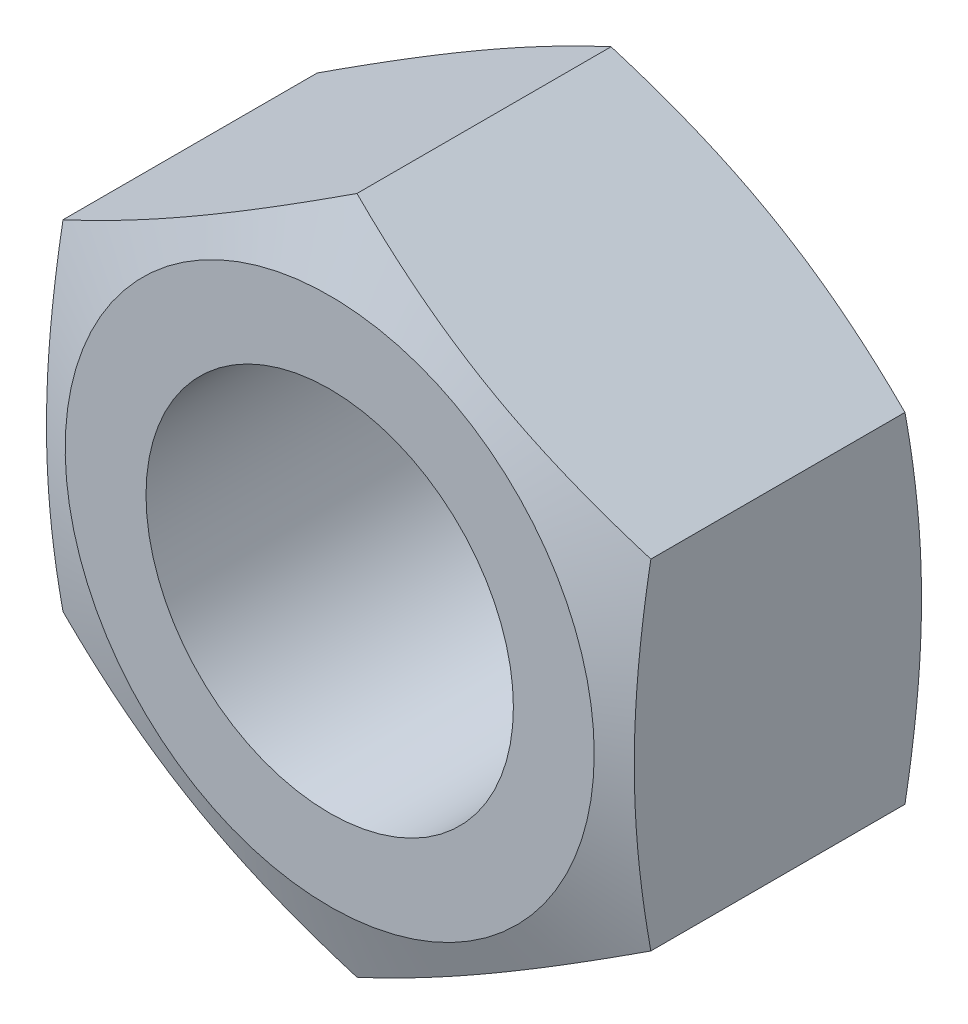
ISO-10303-21;
HEADER;
FILE_DESCRIPTION(('STEP AP214'),'2;1');
FILE_NAME('part.step','',(''),(''),'','','');
FILE_SCHEMA(('AUTOMOTIVE_DESIGN { 1 0 10303 214 1 1 1 1 }'));
ENDSEC;
DATA;
#1=APPLICATION_CONTEXT('core data for automotive mechanical design processes');
#2=APPLICATION_PROTOCOL_DEFINITION('international standard','automotive_design',2000,#1);
#3=PRODUCT_CONTEXT('',#1,'mechanical');
#4=PRODUCT('Part','Part','',(#3));
#5=PRODUCT_RELATED_PRODUCT_CATEGORY('part','',(#4));
#6=PRODUCT_DEFINITION_FORMATION('','',#4);
#7=PRODUCT_DEFINITION_CONTEXT('part definition',#1,'design');
#8=PRODUCT_DEFINITION('design','',#6,#7);
#9=PRODUCT_DEFINITION_SHAPE('','',#8);
#10=(LENGTH_UNIT() NAMED_UNIT(*) SI_UNIT(.MILLI.,.METRE.));
#11=(NAMED_UNIT(*) PLANE_ANGLE_UNIT() SI_UNIT($,.RADIAN.));
#12=(NAMED_UNIT(*) SI_UNIT($,.STERADIAN.) SOLID_ANGLE_UNIT());
#13=UNCERTAINTY_MEASURE_WITH_UNIT(LENGTH_MEASURE(1.E-05),#10,'distance_accuracy_value','');
#14=(GEOMETRIC_REPRESENTATION_CONTEXT(3) GLOBAL_UNCERTAINTY_ASSIGNED_CONTEXT((#13)) GLOBAL_UNIT_ASSIGNED_CONTEXT((#10,
#11,#12)) REPRESENTATION_CONTEXT('',''));
#15=CARTESIAN_POINT('',(0.,0.,0.));
#16=DIRECTION('',(0.,0.,1.));
#17=DIRECTION('',(1.,0.,0.));
#18=AXIS2_PLACEMENT_3D('',#15,#16,#17);
#19=CARTESIAN_POINT('',(8.,4.61880215351701,8.4));
#20=DIRECTION('',(-0.5,-0.866025403784439,0.));
#21=DIRECTION('',(0.866025403784439,-0.5,0.));
#22=AXIS2_PLACEMENT_3D('',#19,#20,#21);
#23=PLANE('',#22);
#24=DIRECTION('',(0.,0.,-1.));
#25=VECTOR('',#24,1.);
#26=CARTESIAN_POINT('',(8.,4.61880215351701,8.4));
#27=LINE('',#26,#25);
#28=CARTESIAN_POINT('',(8.,4.61880215351701,7.65837268302702));
#29=VERTEX_POINT('',#28);
#30=CARTESIAN_POINT('',(8.,4.61880215351701,0.741627316972978));
#31=VERTEX_POINT('',#30);
#32=EDGE_CURVE('E100',#29,#31,#27,.T.);
#33=ORIENTED_EDGE('',*,*,#32,.T.);
#34=CARTESIAN_POINT('',(8.0002,4.61868668346317,0.741669345423533));
#35=CARTESIAN_POINT('',(7.66888592492353,4.80997095389488,0.672022065070619));
#36=CARTESIAN_POINT('',(7.33647933019919,5.00188599083938,0.608665849997043));
#37=CARTESIAN_POINT('',(6.66950483220077,5.38696389680139,0.497200441182387));
#38=CARTESIAN_POINT('',(6.33493544541599,5.58012762232419,0.449103177974534));
#39=CARTESIAN_POINT('',(5.66734825651873,5.96555926554157,0.371307250387889));
#40=CARTESIAN_POINT('',(5.33434570003487,6.15781838116836,0.341438903740367));
#41=CARTESIAN_POINT('',(4.66756186968372,6.54278620511289,0.301377060887247));
#42=CARTESIAN_POINT('',(4.33378093484186,6.7354947176942,0.291176187412957));
#43=CARTESIAN_POINT('',(3.66621906515814,7.12091174285682,0.291176187412957));
#44=CARTESIAN_POINT('',(3.33243813031628,7.31362025543813,0.301377060887247));
#45=CARTESIAN_POINT('',(2.66565429996513,7.69858807938267,0.341438903740368));
#46=CARTESIAN_POINT('',(2.33265174348127,7.89084719500945,0.371307250387889));
#47=CARTESIAN_POINT('',(1.66506455458401,8.27627883822683,0.449103177974535));
#48=CARTESIAN_POINT('',(1.33049516779923,8.46944256374963,0.497200441182387));
#49=CARTESIAN_POINT('',(0.663520669800808,8.85452046971164,0.608665849997044));
#50=CARTESIAN_POINT('',(0.331114075076467,9.04643550665614,0.67202206507062));
#51=CARTESIAN_POINT('',(-0.000199999999998605,9.23771977708785,0.741669345423534));
#52=B_SPLINE_CURVE_WITH_KNOTS('',3,(#34,#35,#36,#37,#38,#39,#40,#41,#42,#43,#44,#45,#46,#47,#48,
#49,#50,#51),.UNSPECIFIED.,.F.,.F.,(4,2,2,2,2,2,2,2,4),(0.,1.16669003993239,2.33429004568844,
3.4908488399045,4.6469737244799,5.80309860905531,6.95965740327137,8.12725740902741,
9.2939474489598),.UNSPECIFIED.);
#53=CARTESIAN_POINT('',(0.,9.23760430703401,0.741627316972978));
#54=VERTEX_POINT('',#53);
#55=EDGE_CURVE('E51',#31,#54,#52,.T.);
#56=ORIENTED_EDGE('',*,*,#55,.T.);
#57=DIRECTION('',(0.,0.,-1.));
#58=VECTOR('',#57,1.);
#59=CARTESIAN_POINT('',(0.,9.23760430703402,8.4));
#60=LINE('',#59,#58);
#61=CARTESIAN_POINT('',(0.,9.23760430703401,7.65837268302702));
#62=VERTEX_POINT('',#61);
#63=EDGE_CURVE('E11',#62,#54,#60,.T.);
#64=ORIENTED_EDGE('',*,*,#63,.F.);
#65=CARTESIAN_POINT('',(-0.000199999999999179,9.23771977708785,7.65833065457647));
#66=CARTESIAN_POINT('',(0.331114075076465,9.04643550665614,7.72797793492938));
#67=CARTESIAN_POINT('',(0.663520669800806,8.85452046971164,7.79133415000296));
#68=CARTESIAN_POINT('',(1.33049516779923,8.46944256374963,7.90279955881761));
#69=CARTESIAN_POINT('',(1.66506455458401,8.27627883822683,7.95089682202547));
#70=CARTESIAN_POINT('',(2.33265174348127,7.89084719500945,8.02869274961211));
#71=CARTESIAN_POINT('',(2.66565429996513,7.69858807938266,8.05856109625963));
#72=CARTESIAN_POINT('',(3.33243813031629,7.31362025543813,8.09862293911275));
#73=CARTESIAN_POINT('',(3.66621906515814,7.12091174285682,8.10882381258704));
#74=CARTESIAN_POINT('',(4.33378093484186,6.7354947176942,8.10882381258704));
#75=CARTESIAN_POINT('',(4.66756186968372,6.54278620511289,8.09862293911275));
#76=CARTESIAN_POINT('',(5.33434570003487,6.15781838116836,8.05856109625963));
#77=CARTESIAN_POINT('',(5.66734825651873,5.96555926554157,8.02869274961211));
#78=CARTESIAN_POINT('',(6.33493544541599,5.58012762232419,7.95089682202547));
#79=CARTESIAN_POINT('',(6.66950483220077,5.38696389680139,7.90279955881761));
#80=CARTESIAN_POINT('',(7.33647933019919,5.00188599083938,7.79133415000296));
#81=CARTESIAN_POINT('',(7.66888592492353,4.80997095389488,7.72797793492938));
#82=CARTESIAN_POINT('',(8.0002,4.61868668346317,7.65833065457647));
#83=B_SPLINE_CURVE_WITH_KNOTS('',3,(#65,#66,#67,#68,#69,#70,#71,#72,#73,#74,#75,#76,#77,#78,#79,
#80,#81,#82),.UNSPECIFIED.,.F.,.F.,(4,2,2,2,2,2,2,2,4),(0.,1.16669003993239,2.33429004568844,
3.4908488399045,4.6469737244799,5.80309860905531,6.95965740327137,8.12725740902741,
9.2939474489598),.UNSPECIFIED.);
#84=EDGE_CURVE('E107',#62,#29,#83,.T.);
#85=ORIENTED_EDGE('',*,*,#84,.T.);
#86=EDGE_LOOP('',(#33,#56,#64,#85));
#87=FACE_BOUND('',#86,.T.);
#88=ADVANCED_FACE('F36',(#87),#23,.F.);
#89=CARTESIAN_POINT('',(0.,9.23760430703402,8.4));
#90=DIRECTION('',(0.5,-0.866025403784439,0.));
#91=DIRECTION('',(0.866025403784439,0.5,0.));
#92=AXIS2_PLACEMENT_3D('',#89,#90,#91);
#93=PLANE('',#92);
#94=ORIENTED_EDGE('',*,*,#63,.T.);
#95=CARTESIAN_POINT('',(0.000200000000000869,9.23771977708785,0.741669345423534));
#96=CARTESIAN_POINT('',(-0.331114075076465,9.04643550665614,0.67202206507062));
#97=CARTESIAN_POINT('',(-0.663520669800805,8.85452046971164,0.608665849997044));
#98=CARTESIAN_POINT('',(-1.33049516779922,8.46944256374964,0.497200441182387));
#99=CARTESIAN_POINT('',(-1.66506455458401,8.27627883822683,0.449103177974535));
#100=CARTESIAN_POINT('',(-2.33265174348127,7.89084719500945,0.371307250387889));
#101=CARTESIAN_POINT('',(-2.66565429996512,7.69858807938267,0.341438903740367));
#102=CARTESIAN_POINT('',(-3.33243813031628,7.31362025543814,0.301377060887247));
#103=CARTESIAN_POINT('',(-3.66621906515814,7.12091174285682,0.291176187412957));
#104=CARTESIAN_POINT('',(-4.33378093484186,6.7354947176942,0.291176187412957));
#105=CARTESIAN_POINT('',(-4.66756186968372,6.54278620511289,0.301377060887246));
#106=CARTESIAN_POINT('',(-5.33434570003487,6.15781838116836,0.341438903740367));
#107=CARTESIAN_POINT('',(-5.66734825651873,5.96555926554157,0.371307250387889));
#108=CARTESIAN_POINT('',(-6.33493544541599,5.58012762232419,0.449103177974535));
#109=CARTESIAN_POINT('',(-6.66950483220077,5.38696389680139,0.497200441182387));
#110=CARTESIAN_POINT('',(-7.33647933019919,5.00188599083939,0.608665849997043));
#111=CARTESIAN_POINT('',(-7.66888592492353,4.80997095389488,0.672022065070619));
#112=CARTESIAN_POINT('',(-8.0002,4.61868668346317,0.741669345423533));
#113=B_SPLINE_CURVE_WITH_KNOTS('',3,(#95,#96,#97,#98,#99,#100,#101,#102,#103,#104,#105,#106,
#107,#108,#109,#110,#111,#112),.UNSPECIFIED.,.F.,.F.,(4,2,2,2,2,2,2,2,4),(0.,1.16669003993239,
2.33429004568844,3.4908488399045,4.6469737244799,5.80309860905531,6.95965740327137,
8.12725740902741,9.2939474489598),.UNSPECIFIED.);
#114=CARTESIAN_POINT('',(-8.,4.61880215351701,0.741627316972978));
#115=VERTEX_POINT('',#114);
#116=EDGE_CURVE('E87',#54,#115,#113,.T.);
#117=ORIENTED_EDGE('',*,*,#116,.T.);
#118=DIRECTION('',(0.,0.,-1.));
#119=VECTOR('',#118,1.);
#120=CARTESIAN_POINT('',(-8.,4.61880215351701,8.4));
#121=LINE('',#120,#119);
#122=CARTESIAN_POINT('',(-8.,4.61880215351701,7.65837268302702));
#123=VERTEX_POINT('',#122);
#124=EDGE_CURVE('E44',#123,#115,#121,.T.);
#125=ORIENTED_EDGE('',*,*,#124,.F.);
#126=CARTESIAN_POINT('',(-8.0002,4.61868668346317,7.65833065457647));
#127=CARTESIAN_POINT('',(-7.66888592492353,4.80997095389488,7.72797793492938));
#128=CARTESIAN_POINT('',(-7.33647933019919,5.00188599083939,7.79133415000296));
#129=CARTESIAN_POINT('',(-6.66950483220077,5.38696389680139,7.90279955881761));
#130=CARTESIAN_POINT('',(-6.33493544541599,5.58012762232419,7.95089682202547));
#131=CARTESIAN_POINT('',(-5.66734825651873,5.96555926554157,8.02869274961211));
#132=CARTESIAN_POINT('',(-5.33434570003487,6.15781838116836,8.05856109625963));
#133=CARTESIAN_POINT('',(-4.66756186968371,6.54278620511289,8.09862293911275));
#134=CARTESIAN_POINT('',(-4.33378093484186,6.7354947176942,8.10882381258704));
#135=CARTESIAN_POINT('',(-3.66621906515814,7.12091174285682,8.10882381258704));
#136=CARTESIAN_POINT('',(-3.33243813031628,7.31362025543814,8.09862293911275));
#137=CARTESIAN_POINT('',(-2.66565429996512,7.69858807938267,8.05856109625963));
#138=CARTESIAN_POINT('',(-2.33265174348127,7.89084719500945,8.02869274961211));
#139=CARTESIAN_POINT('',(-1.66506455458401,8.27627883822683,7.95089682202547));
#140=CARTESIAN_POINT('',(-1.33049516779922,8.46944256374964,7.90279955881761));
#141=CARTESIAN_POINT('',(-0.663520669800805,8.85452046971164,7.79133415000296));
#142=CARTESIAN_POINT('',(-0.331114075076464,9.04643550665614,7.72797793492938));
#143=CARTESIAN_POINT('',(0.000200000000001609,9.23771977708785,7.65833065457647));
#144=B_SPLINE_CURVE_WITH_KNOTS('',3,(#126,#127,#128,#129,#130,#131,#132,#133,#134,#135,#136,
#137,#138,#139,#140,#141,#142,#143),.UNSPECIFIED.,.F.,.F.,(4,2,2,2,2,2,2,2,4),(0.,
1.16669003993239,2.33429004568844,3.4908488399045,4.6469737244799,5.80309860905531,
6.95965740327137,8.12725740902742,9.29394744895981),.UNSPECIFIED.);
#145=EDGE_CURVE('E105',#123,#62,#144,.T.);
#146=ORIENTED_EDGE('',*,*,#145,.T.);
#147=EDGE_LOOP('',(#94,#117,#125,#146));
#148=FACE_BOUND('',#147,.T.);
#149=ADVANCED_FACE('F104',(#148),#93,.F.);
#150=CARTESIAN_POINT('',(-8.,4.61880215351701,8.4));
#151=DIRECTION('',(1.,0.,0.));
#152=DIRECTION('',(0.,0.,-1.));
#153=AXIS2_PLACEMENT_3D('',#150,#151,#152);
#154=PLANE('',#153);
#155=ORIENTED_EDGE('',*,*,#124,.T.);
#156=CARTESIAN_POINT('',(-8.,-12.2012465070847,2.68976892333336));
#157=CARTESIAN_POINT('',(-8.,-11.8395797268916,2.57971664638268));
#158=CARTESIAN_POINT('',(-8.,-11.4775129745061,2.47095469943747));
#159=CARTESIAN_POINT('',(-8.,-10.7523759536434,2.25672537454875));
#160=CARTESIAN_POINT('',(-8.,-10.3893056076072,2.15125825944853));
#161=CARTESIAN_POINT('',(-8.,-9.66133032170624,1.94415537245914));
#162=CARTESIAN_POINT('',(-8.,-9.29642321429732,1.84252719200734));
#163=CARTESIAN_POINT('',(-8.,-8.56524765596295,1.64429920018268));
#164=CARTESIAN_POINT('',(-8.,-8.19897922981423,1.54769929776793));
#165=CARTESIAN_POINT('',(-8.,-7.46941725801853,1.36193890603852));
#166=CARTESIAN_POINT('',(-8.,-7.10614361727276,1.27270063058997));
#167=CARTESIAN_POINT('',(-8.,-6.37778553417726,1.10186352457761));
#168=CARTESIAN_POINT('',(-8.,-6.01270106139447,1.02026482286657));
#169=CARTESIAN_POINT('',(-8.,-5.2806446716286,0.866618219020676));
#170=CARTESIAN_POINT('',(-8.,-4.91367346354291,0.794566968295231));
#171=CARTESIAN_POINT('',(-8.,-4.17760203573368,0.662216813209921));
#172=CARTESIAN_POINT('',(-8.,-3.80850188840076,0.60191751164426));
#173=CARTESIAN_POINT('',(-8.,-3.10978401210953,0.501500156819337));
#174=CARTESIAN_POINT('',(-8.,-2.78038468387203,0.459876592034956));
#175=CARTESIAN_POINT('',(-8.,-2.12020164786822,0.389510202171706));
#176=CARTESIAN_POINT('',(-8.,-1.7894179808473,0.360767000637724));
#177=CARTESIAN_POINT('',(-8.,-1.12713777276092,0.317545968706963));
#178=CARTESIAN_POINT('',(-8.,-0.795641894133838,0.303058150399562));
#179=CARTESIAN_POINT('',(-8.,-0.132330663304852,0.289080589118507));
#180=CARTESIAN_POINT('',(-8.,0.199484686775025,0.289590747201553));
#181=CARTESIAN_POINT('',(-8.,0.864453561039091,0.305622434872368));
#182=CARTESIAN_POINT('',(-8.,1.19760519388157,0.321221132068799));
#183=CARTESIAN_POINT('',(-8.,1.86292258606595,0.366713112261245));
#184=CARTESIAN_POINT('',(-8.,2.19508832155158,0.396606738366912));
#185=CARTESIAN_POINT('',(-8.,2.8582730023951,0.469296013588502));
#186=CARTESIAN_POINT('',(-8.,3.18929071985207,0.512102706340689));
#187=CARTESIAN_POINT('',(-8.,3.84966990778504,0.60888987101674));
#188=CARTESIAN_POINT('',(-8.,4.17903137034679,0.662870396281798));
#189=CARTESIAN_POINT('',(-8.,4.85578954965823,0.78378315220344));
#190=CARTESIAN_POINT('',(-8.,5.20308114976631,0.851298615671584));
#191=CARTESIAN_POINT('',(-8.,5.8958729755086,0.99502008300367));
#192=CARTESIAN_POINT('',(-8.,6.24137306215684,1.07122675089118));
#193=CARTESIAN_POINT('',(-8.,6.93083211103907,1.23072133759787));
#194=CARTESIAN_POINT('',(-8.,7.2747905887021,1.31401133823848));
#195=CARTESIAN_POINT('',(-8.,7.96125577980735,1.48631199728717));
#196=CARTESIAN_POINT('',(-8.,8.30376252837524,1.57532251643104));
#197=CARTESIAN_POINT('',(-8.,8.98797246393002,1.75810796419165));
#198=CARTESIAN_POINT('',(-8.,9.32967403856263,1.85188890633579));
#199=CARTESIAN_POINT('',(-8.,10.0120101084172,2.04325051910106));
#200=CARTESIAN_POINT('',(-8.,10.3526445990318,2.14083120610407));
#201=CARTESIAN_POINT('',(-8.,11.0329439949655,2.33909251985292));
#202=CARTESIAN_POINT('',(-8.,11.3726090587723,2.43977260391318));
#203=CARTESIAN_POINT('',(-8.,12.0511645932301,2.64371294166164));
#204=CARTESIAN_POINT('',(-8.,12.3900550588275,2.7469732121313));
#205=CARTESIAN_POINT('',(-8.,13.3980187878993,3.05757662208139));
#206=CARTESIAN_POINT('',(-8.,14.0661350583115,3.2680247327584));
#207=CARTESIAN_POINT('',(-8.,15.4004993258991,3.69484331066199));
#208=CARTESIAN_POINT('',(-8.,16.0667472306511,3.91121406536194));
#209=CARTESIAN_POINT('',(-8.,17.3952834743278,4.34746385567968));
#210=CARTESIAN_POINT('',(-8.,18.0575772329867,4.56732640753336));
#211=CARTESIAN_POINT('',(-8.,19.0501761465397,4.89953990317161));
#212=CARTESIAN_POINT('',(-8.,19.3808888168254,5.01067647320841));
#213=CARTESIAN_POINT('',(-8.,20.0420727112734,5.23366301685999));
#214=CARTESIAN_POINT('',(-8.,20.372543936015,5.34551298875644));
#215=CARTESIAN_POINT('',(-8.,20.7029103202752,5.45767192727596));
#216=B_SPLINE_CURVE_WITH_KNOTS('',3,(#156,#157,#158,#159,#160,#161,#162,#163,#164,#165,#166,
#167,#168,#169,#170,#171,#172,#173,#174,#175,#176,#177,#178,#179,#180,#181,#182,#183,#184,#185,
#186,#187,#188,#189,#190,#191,#192,#193,#194,#195,#196,#197,#198,#199,#200,#201,#202,#203,#204,
#205,#206,#207,#208,#209,#210,#211,#212,#213,#214,#215),.UNSPECIFIED.,.F.,.F.,(4,2,2,2,2,2,2,2,
2,2,2,2,2,2,2,2,2,2,2,2,2,2,2,2,2,2,2,2,2,4),(0.,1.13412858668859,2.26834741798613,
3.40470280532163,4.54103761067246,5.66319372998892,6.78536877272611,7.90714918579649,
9.02889167707377,10.0247284714551,11.0205361585588,12.015645643774,13.0107485641439,
14.0109678146744,15.011211073866,16.0123122076364,17.0134181205334,18.0746616206325,
19.1359862560193,20.1976239043855,21.2592357173014,22.3222206527477,23.3852101715616,
24.4480146142958,25.5108259712818,27.6122114472173,29.7136991017234,31.8071897257365,
32.8538504517433,33.9005086576659),.UNSPECIFIED.);
#217=CARTESIAN_POINT('',(-8.,-4.61880215351701,0.741627316972978));
#218=VERTEX_POINT('',#217);
#219=EDGE_CURVE('E90',#115,#218,#216,.F.);
#220=ORIENTED_EDGE('',*,*,#219,.T.);
#221=DIRECTION('',(0.,0.,-1.));
#222=VECTOR('',#221,1.);
#223=CARTESIAN_POINT('',(-8.,-4.61880215351701,8.4));
#224=LINE('',#223,#222);
#225=CARTESIAN_POINT('',(-8.,-4.61880215351701,7.65837268302702));
#226=VERTEX_POINT('',#225);
#227=EDGE_CURVE('E216',#226,#218,#224,.T.);
#228=ORIENTED_EDGE('',*,*,#227,.F.);
#229=CARTESIAN_POINT('',(-8.,-12.2012465070847,5.71023107666664));
#230=CARTESIAN_POINT('',(-8.,-11.8395797268916,5.82028335361732));
#231=CARTESIAN_POINT('',(-8.,-11.4775129745061,5.92904530056253));
#232=CARTESIAN_POINT('',(-8.,-10.7523759536434,6.14327462545126));
#233=CARTESIAN_POINT('',(-8.,-10.3893056076072,6.24874174055148));
#234=CARTESIAN_POINT('',(-8.,-9.66133032170624,6.45584462754086));
#235=CARTESIAN_POINT('',(-8.,-9.29642321429732,6.55747280799266));
#236=CARTESIAN_POINT('',(-8.,-8.56524765596294,6.75570079981733));
#237=CARTESIAN_POINT('',(-8.,-8.19897922981423,6.85230070223207));
#238=CARTESIAN_POINT('',(-8.,-7.46941725801853,7.03806109396148));
#239=CARTESIAN_POINT('',(-8.,-7.10614361727276,7.12729936941003));
#240=CARTESIAN_POINT('',(-8.,-6.37778553417725,7.29813647542239));
#241=CARTESIAN_POINT('',(-8.,-6.01270106139447,7.37973517713343));
#242=CARTESIAN_POINT('',(-8.,-5.2806446716286,7.53338178097933));
#243=CARTESIAN_POINT('',(-8.,-4.91367346354291,7.60543303170477));
#244=CARTESIAN_POINT('',(-8.,-4.17760203573368,7.73778318679008));
#245=CARTESIAN_POINT('',(-8.,-3.80850188840076,7.79808248835574));
#246=CARTESIAN_POINT('',(-8.,-3.10978401210953,7.89849984318066));
#247=CARTESIAN_POINT('',(-8.,-2.78038468387203,7.94012340796504));
#248=CARTESIAN_POINT('',(-8.,-2.12020164786822,8.0104897978283));
#249=CARTESIAN_POINT('',(-8.,-1.7894179808473,8.03923299936228));
#250=CARTESIAN_POINT('',(-8.,-1.12713777276092,8.08245403129304));
#251=CARTESIAN_POINT('',(-8.,-0.795641894133843,8.09694184960044));
#252=CARTESIAN_POINT('',(-8.,-0.132330663304856,8.11091941088149));
#253=CARTESIAN_POINT('',(-8.,0.199484686775021,8.11040925279845));
#254=CARTESIAN_POINT('',(-8.,0.864453561039087,8.09437756512763));
#255=CARTESIAN_POINT('',(-8.,1.19760519388157,8.0787788679312));
#256=CARTESIAN_POINT('',(-8.,1.86292258606594,8.03328688773875));
#257=CARTESIAN_POINT('',(-8.,2.19508832155158,8.00339326163309));
#258=CARTESIAN_POINT('',(-8.,2.8582730023951,7.9307039864115));
#259=CARTESIAN_POINT('',(-8.,3.18929071985207,7.88789729365931));
#260=CARTESIAN_POINT('',(-8.,3.84966990778504,7.79111012898326));
#261=CARTESIAN_POINT('',(-8.,4.17903137034678,7.7371296037182));
#262=CARTESIAN_POINT('',(-8.,4.85578954965823,7.61621684779656));
#263=CARTESIAN_POINT('',(-8.,5.20308114976631,7.54870138432842));
#264=CARTESIAN_POINT('',(-8.,5.8958729755086,7.40497991699633));
#265=CARTESIAN_POINT('',(-8.,6.24137306215684,7.32877324910882));
#266=CARTESIAN_POINT('',(-8.,6.93083211103907,7.16927866240213));
#267=CARTESIAN_POINT('',(-8.,7.2747905887021,7.08598866176152));
#268=CARTESIAN_POINT('',(-8.,7.96125577980735,6.91368800271283));
#269=CARTESIAN_POINT('',(-8.,8.30376252837525,6.82467748356896));
#270=CARTESIAN_POINT('',(-8.,8.98797246393002,6.64189203580835));
#271=CARTESIAN_POINT('',(-8.,9.32967403856263,6.54811109366421));
#272=CARTESIAN_POINT('',(-8.,10.0120101084172,6.35674948089894));
#273=CARTESIAN_POINT('',(-8.,10.3526445990318,6.25916879389593));
#274=CARTESIAN_POINT('',(-8.,11.0329439949655,6.06090748014708));
#275=CARTESIAN_POINT('',(-8.,11.3726090587723,5.96022739608682));
#276=CARTESIAN_POINT('',(-8.,12.0511645932301,5.75628705833836));
#277=CARTESIAN_POINT('',(-8.,12.3900550588275,5.6530267878687));
#278=CARTESIAN_POINT('',(-8.,13.3980187878993,5.34242337791861));
#279=CARTESIAN_POINT('',(-8.,14.0661350583115,5.1319752672416));
#280=CARTESIAN_POINT('',(-8.,15.4004993258991,4.70515668933801));
#281=CARTESIAN_POINT('',(-8.,16.0667472306511,4.48878593463807));
#282=CARTESIAN_POINT('',(-8.,17.3952834743278,4.05253614432032));
#283=CARTESIAN_POINT('',(-8.,18.0575772329867,3.83267359246664));
#284=CARTESIAN_POINT('',(-8.,19.0501761465397,3.50046009682839));
#285=CARTESIAN_POINT('',(-8.,19.3808888168254,3.38932352679159));
#286=CARTESIAN_POINT('',(-8.,20.0420727112734,3.16633698314001));
#287=CARTESIAN_POINT('',(-8.,20.372543936015,3.05448701124356));
#288=CARTESIAN_POINT('',(-8.,20.7029103202752,2.94232807272404));
#289=B_SPLINE_CURVE_WITH_KNOTS('',3,(#229,#230,#231,#232,#233,#234,#235,#236,#237,#238,#239,
#240,#241,#242,#243,#244,#245,#246,#247,#248,#249,#250,#251,#252,#253,#254,#255,#256,#257,#258,
#259,#260,#261,#262,#263,#264,#265,#266,#267,#268,#269,#270,#271,#272,#273,#274,#275,#276,#277,
#278,#279,#280,#281,#282,#283,#284,#285,#286,#287,#288),.UNSPECIFIED.,.F.,.F.,(4,2,2,2,2,2,2,2,
2,2,2,2,2,2,2,2,2,2,2,2,2,2,2,2,2,2,2,2,2,4),(0.,1.13412858668859,2.26834741798613,
3.40470280532164,4.54103761067246,5.66319372998892,6.78536877272611,7.9071491857965,
9.02889167707377,10.0247284714551,11.0205361585588,12.015645643774,13.0107485641439,
14.0109678146744,15.011211073866,16.0123122076364,17.0134181205334,18.0746616206325,
19.1359862560193,20.1976239043855,21.2592357173014,22.3222206527477,23.3852101715616,
24.4480146142958,25.5108259712818,27.6122114472173,29.7136991017234,31.8071897257365,
32.8538504517433,33.9005086576659),.UNSPECIFIED.);
#290=EDGE_CURVE('E108',#226,#123,#289,.T.);
#291=ORIENTED_EDGE('',*,*,#290,.T.);
#292=EDGE_LOOP('',(#155,#220,#228,#291));
#293=FACE_BOUND('',#292,.T.);
#294=ADVANCED_FACE('F170',(#293),#154,.F.);
#295=CARTESIAN_POINT('',(-8.,-4.61880215351701,8.4));
#296=DIRECTION('',(0.5,0.866025403784439,0.));
#297=DIRECTION('',(-0.866025403784439,0.5,0.));
#298=AXIS2_PLACEMENT_3D('',#295,#296,#297);
#299=PLANE('',#298);
#300=ORIENTED_EDGE('',*,*,#227,.T.);
#301=CARTESIAN_POINT('',(-8.0002,-4.61868668346317,0.741669345423533));
#302=CARTESIAN_POINT('',(-7.66888592492353,-4.80997095389488,0.672022065070619));
#303=CARTESIAN_POINT('',(-7.33647933019919,-5.00188599083938,0.608665849997043));
#304=CARTESIAN_POINT('',(-6.66950483220077,-5.38696389680139,0.497200441182386));
#305=CARTESIAN_POINT('',(-6.33493544541599,-5.58012762232419,0.449103177974534));
#306=CARTESIAN_POINT('',(-5.66734825651873,-5.96555926554157,0.371307250387888));
#307=CARTESIAN_POINT('',(-5.33434570003487,-6.15781838116836,0.341438903740367));
#308=CARTESIAN_POINT('',(-4.66756186968372,-6.54278620511289,0.301377060887246));
#309=CARTESIAN_POINT('',(-4.33378093484186,-6.7354947176942,0.291176187412957));
#310=CARTESIAN_POINT('',(-3.66621906515814,-7.12091174285682,0.291176187412957));
#311=CARTESIAN_POINT('',(-3.33243813031629,-7.31362025543813,0.301377060887246));
#312=CARTESIAN_POINT('',(-2.66565429996513,-7.69858807938266,0.341438903740367));
#313=CARTESIAN_POINT('',(-2.33265174348127,-7.89084719500945,0.371307250387888));
#314=CARTESIAN_POINT('',(-1.66506455458401,-8.27627883822683,0.449103177974534));
#315=CARTESIAN_POINT('',(-1.33049516779923,-8.46944256374963,0.497200441182387));
#316=CARTESIAN_POINT('',(-0.663520669800808,-8.85452046971164,0.608665849997043));
#317=CARTESIAN_POINT('',(-0.331114075076467,-9.04643550665614,0.672022065070619));
#318=CARTESIAN_POINT('',(0.000199999999998423,-9.23771977708785,0.741669345423533));
#319=B_SPLINE_CURVE_WITH_KNOTS('',3,(#301,#302,#303,#304,#305,#306,#307,#308,#309,#310,#311,
#312,#313,#314,#315,#316,#317,#318),.UNSPECIFIED.,.F.,.F.,(4,2,2,2,2,2,2,2,4),(0.,
1.16669003993239,2.33429004568844,3.4908488399045,4.6469737244799,5.80309860905531,
6.95965740327137,8.12725740902741,9.2939474489598),.UNSPECIFIED.);
#320=CARTESIAN_POINT('',(0.,-9.23760430703401,0.741627316972978));
#321=VERTEX_POINT('',#320);
#322=EDGE_CURVE('E176',#218,#321,#319,.T.);
#323=ORIENTED_EDGE('',*,*,#322,.T.);
#324=DIRECTION('',(0.,0.,-1.));
#325=VECTOR('',#324,1.);
#326=CARTESIAN_POINT('',(0.,-9.23760430703401,8.4));
#327=LINE('',#326,#325);
#328=CARTESIAN_POINT('',(0.,-9.23760430703401,7.65837268302702));
#329=VERTEX_POINT('',#328);
#330=EDGE_CURVE('E212',#329,#321,#327,.T.);
#331=ORIENTED_EDGE('',*,*,#330,.F.);
#332=CARTESIAN_POINT('',(0.000199999999999158,-9.23771977708785,7.65833065457647));
#333=CARTESIAN_POINT('',(-0.331114075076467,-9.04643550665614,7.72797793492938));
#334=CARTESIAN_POINT('',(-0.663520669800807,-8.85452046971164,7.79133415000296));
#335=CARTESIAN_POINT('',(-1.33049516779923,-8.46944256374963,7.90279955881761));
#336=CARTESIAN_POINT('',(-1.66506455458401,-8.27627883822683,7.95089682202547));
#337=CARTESIAN_POINT('',(-2.33265174348127,-7.89084719500945,8.02869274961211));
#338=CARTESIAN_POINT('',(-2.66565429996513,-7.69858807938266,8.05856109625963));
#339=CARTESIAN_POINT('',(-3.33243813031629,-7.31362025543813,8.09862293911275));
#340=CARTESIAN_POINT('',(-3.66621906515814,-7.12091174285682,8.10882381258705));
#341=CARTESIAN_POINT('',(-4.33378093484186,-6.7354947176942,8.10882381258705));
#342=CARTESIAN_POINT('',(-4.66756186968372,-6.54278620511289,8.09862293911275));
#343=CARTESIAN_POINT('',(-5.33434570003488,-6.15781838116835,8.05856109625963));
#344=CARTESIAN_POINT('',(-5.66734825651873,-5.96555926554157,8.02869274961211));
#345=CARTESIAN_POINT('',(-6.33493544541599,-5.58012762232419,7.95089682202547));
#346=CARTESIAN_POINT('',(-6.66950483220077,-5.38696389680138,7.90279955881761));
#347=CARTESIAN_POINT('',(-7.33647933019919,-5.00188599083938,7.79133415000296));
#348=CARTESIAN_POINT('',(-7.66888592492354,-4.80997095389488,7.72797793492938));
#349=CARTESIAN_POINT('',(-8.0002,-4.61868668346317,7.65833065457647));
#350=B_SPLINE_CURVE_WITH_KNOTS('',3,(#332,#333,#334,#335,#336,#337,#338,#339,#340,#341,#342,
#343,#344,#345,#346,#347,#348,#349),.UNSPECIFIED.,.F.,.F.,(4,2,2,2,2,2,2,2,4),(0.,
1.16669003993239,2.33429004568844,3.4908488399045,4.6469737244799,5.80309860905531,
6.95965740327137,8.12725740902741,9.2939474489598),.UNSPECIFIED.);
#351=EDGE_CURVE('E111',#329,#226,#350,.T.);
#352=ORIENTED_EDGE('',*,*,#351,.T.);
#353=EDGE_LOOP('',(#300,#323,#331,#352));
#354=FACE_BOUND('',#353,.T.);
#355=ADVANCED_FACE('F166',(#354),#299,.F.);
#356=CARTESIAN_POINT('',(0.,-9.23760430703401,8.4));
#357=DIRECTION('',(-0.5,0.866025403784439,0.));
#358=DIRECTION('',(-0.866025403784439,-0.5,0.));
#359=AXIS2_PLACEMENT_3D('',#356,#357,#358);
#360=PLANE('',#359);
#361=ORIENTED_EDGE('',*,*,#330,.T.);
#362=CARTESIAN_POINT('',(-0.00020000000000054,-9.23771977708785,0.741669345423533));
#363=CARTESIAN_POINT('',(0.331114075076465,-9.04643550665614,0.672022065070619));
#364=CARTESIAN_POINT('',(0.663520669800806,-8.85452046971164,0.608665849997043));
#365=CARTESIAN_POINT('',(1.33049516779923,-8.46944256374963,0.497200441182387));
#366=CARTESIAN_POINT('',(1.66506455458401,-8.27627883822683,0.449103177974534));
#367=CARTESIAN_POINT('',(2.33265174348127,-7.89084719500945,0.371307250387889));
#368=CARTESIAN_POINT('',(2.66565429996513,-7.69858807938266,0.341438903740367));
#369=CARTESIAN_POINT('',(3.33243813031628,-7.31362025543813,0.301377060887247));
#370=CARTESIAN_POINT('',(3.66621906515814,-7.12091174285682,0.291176187412957));
#371=CARTESIAN_POINT('',(4.33378093484186,-6.7354947176942,0.291176187412957));
#372=CARTESIAN_POINT('',(4.66756186968372,-6.54278620511289,0.301377060887247));
#373=CARTESIAN_POINT('',(5.33434570003488,-6.15781838116836,0.341438903740368));
#374=CARTESIAN_POINT('',(5.66734825651873,-5.96555926554157,0.371307250387889));
#375=CARTESIAN_POINT('',(6.33493544541599,-5.58012762232419,0.449103177974534));
#376=CARTESIAN_POINT('',(6.66950483220078,-5.38696389680139,0.497200441182388));
#377=CARTESIAN_POINT('',(7.3364793301992,-5.00188599083938,0.608665849997045));
#378=CARTESIAN_POINT('',(7.66888592492354,-4.80997095389488,0.67202206507062));
#379=CARTESIAN_POINT('',(8.0002,-4.61868668346317,0.741669345423534));
#380=B_SPLINE_CURVE_WITH_KNOTS('',3,(#362,#363,#364,#365,#366,#367,#368,#369,#370,#371,#372,
#373,#374,#375,#376,#377,#378,#379),.UNSPECIFIED.,.F.,.F.,(4,2,2,2,2,2,2,2,4),(0.,
1.16669003993239,2.33429004568844,3.4908488399045,4.6469737244799,5.80309860905531,
6.95965740327137,8.12725740902742,9.29394744895981),.UNSPECIFIED.);
#381=CARTESIAN_POINT('',(8.,-4.61880215351701,0.741627316972978));
#382=VERTEX_POINT('',#381);
#383=EDGE_CURVE('E184',#321,#382,#380,.T.);
#384=ORIENTED_EDGE('',*,*,#383,.T.);
#385=DIRECTION('',(0.,0.,-1.));
#386=VECTOR('',#385,1.);
#387=CARTESIAN_POINT('',(8.,-4.61880215351701,8.4));
#388=LINE('',#387,#386);
#389=CARTESIAN_POINT('',(8.,-4.61880215351701,7.65837268302702));
#390=VERTEX_POINT('',#389);
#391=EDGE_CURVE('E213',#390,#382,#388,.T.);
#392=ORIENTED_EDGE('',*,*,#391,.F.);
#393=CARTESIAN_POINT('',(8.0002,-4.61868668346317,7.65833065457647));
#394=CARTESIAN_POINT('',(7.66888592492353,-4.80997095389488,7.72797793492938));
#395=CARTESIAN_POINT('',(7.33647933019919,-5.00188599083939,7.79133415000296));
#396=CARTESIAN_POINT('',(6.66950483220077,-5.38696389680139,7.90279955881761));
#397=CARTESIAN_POINT('',(6.33493544541599,-5.58012762232419,7.95089682202547));
#398=CARTESIAN_POINT('',(5.66734825651873,-5.96555926554157,8.02869274961211));
#399=CARTESIAN_POINT('',(5.33434570003487,-6.15781838116836,8.05856109625963));
#400=CARTESIAN_POINT('',(4.66756186968372,-6.54278620511289,8.09862293911275));
#401=CARTESIAN_POINT('',(4.33378093484186,-6.7354947176942,8.10882381258704));
#402=CARTESIAN_POINT('',(3.66621906515814,-7.12091174285682,8.10882381258704));
#403=CARTESIAN_POINT('',(3.33243813031628,-7.31362025543813,8.09862293911275));
#404=CARTESIAN_POINT('',(2.66565429996513,-7.69858807938266,8.05856109625963));
#405=CARTESIAN_POINT('',(2.33265174348127,-7.89084719500945,8.02869274961211));
#406=CARTESIAN_POINT('',(1.66506455458401,-8.27627883822683,7.95089682202547));
#407=CARTESIAN_POINT('',(1.33049516779923,-8.46944256374963,7.90279955881761));
#408=CARTESIAN_POINT('',(0.663520669800807,-8.85452046971164,7.79133415000296));
#409=CARTESIAN_POINT('',(0.331114075076466,-9.04643550665614,7.72797793492938));
#410=CARTESIAN_POINT('',(-0.000199999999999254,-9.23771977708785,7.65833065457647));
#411=B_SPLINE_CURVE_WITH_KNOTS('',3,(#393,#394,#395,#396,#397,#398,#399,#400,#401,#402,#403,
#404,#405,#406,#407,#408,#409,#410),.UNSPECIFIED.,.F.,.F.,(4,2,2,2,2,2,2,2,4),(0.,
1.16669003993239,2.33429004568844,3.4908488399045,4.6469737244799,5.80309860905531,
6.95965740327137,8.12725740902741,9.2939474489598),.UNSPECIFIED.);
#412=EDGE_CURVE('E59',#390,#329,#411,.T.);
#413=ORIENTED_EDGE('',*,*,#412,.T.);
#414=EDGE_LOOP('',(#361,#384,#392,#413));
#415=FACE_BOUND('',#414,.T.);
#416=ADVANCED_FACE('F169',(#415),#360,.F.);
#417=CARTESIAN_POINT('',(8.,-4.61880215351701,8.4));
#418=DIRECTION('',(-1.,0.,0.));
#419=DIRECTION('',(0.,-1.,0.));
#420=AXIS2_PLACEMENT_3D('',#417,#418,#419);
#421=PLANE('',#420);
#422=ORIENTED_EDGE('',*,*,#391,.T.);
#423=CARTESIAN_POINT('',(8.,-12.2012465070847,2.68976892333336));
#424=CARTESIAN_POINT('',(8.,-11.8395797268916,2.57971664638268));
#425=CARTESIAN_POINT('',(8.,-11.4775129745061,2.47095469943747));
#426=CARTESIAN_POINT('',(8.,-10.7523759536434,2.25672537454875));
#427=CARTESIAN_POINT('',(8.,-10.3893056076073,2.15125825944853));
#428=CARTESIAN_POINT('',(8.,-9.66133032170625,1.94415537245914));
#429=CARTESIAN_POINT('',(8.,-9.29642321429733,1.84252719200734));
#430=CARTESIAN_POINT('',(8.,-8.56524765596295,1.64429920018268));
#431=CARTESIAN_POINT('',(8.,-8.19897922981424,1.54769929776793));
#432=CARTESIAN_POINT('',(8.,-7.46941725801854,1.36193890603852));
#433=CARTESIAN_POINT('',(8.,-7.10614361727277,1.27270063058997));
#434=CARTESIAN_POINT('',(8.,-6.37778553417726,1.10186352457762));
#435=CARTESIAN_POINT('',(8.,-6.01270106139447,1.02026482286657));
#436=CARTESIAN_POINT('',(8.,-5.2806446716286,0.866618219020678));
#437=CARTESIAN_POINT('',(8.,-4.91367346354292,0.794566968295232));
#438=CARTESIAN_POINT('',(8.,-4.17760203573369,0.662216813209922));
#439=CARTESIAN_POINT('',(8.,-3.80850188840076,0.601917511644261));
#440=CARTESIAN_POINT('',(8.,-3.10978401210954,0.501500156819338));
#441=CARTESIAN_POINT('',(8.,-2.78038468387204,0.459876592034957));
#442=CARTESIAN_POINT('',(8.,-2.12020164786823,0.389510202171707));
#443=CARTESIAN_POINT('',(8.,-1.78941798084731,0.360767000637725));
#444=CARTESIAN_POINT('',(8.,-1.12713777276093,0.317545968706963));
#445=CARTESIAN_POINT('',(8.,-0.795641894133847,0.303058150399562));
#446=CARTESIAN_POINT('',(8.,-0.132330663304859,0.289080589118507));
#447=CARTESIAN_POINT('',(8.,0.199484686775019,0.289590747201553));
#448=CARTESIAN_POINT('',(8.,0.864453561039085,0.305622434872368));
#449=CARTESIAN_POINT('',(8.,1.19760519388156,0.321221132068799));
#450=CARTESIAN_POINT('',(8.,1.86292258606594,0.366713112261245));
#451=CARTESIAN_POINT('',(8.,2.19508832155158,0.396606738366911));
#452=CARTESIAN_POINT('',(8.,2.8582730023951,0.469296013588501));
#453=CARTESIAN_POINT('',(8.,3.18929071985207,0.512102706340687));
#454=CARTESIAN_POINT('',(8.,3.84966990778503,0.608889871016739));
#455=CARTESIAN_POINT('',(8.,4.17903137034678,0.662870396281797));
#456=CARTESIAN_POINT('',(8.,4.85578954965823,0.783783152203439));
#457=CARTESIAN_POINT('',(8.,5.20308114976631,0.851298615671583));
#458=CARTESIAN_POINT('',(8.,5.89587297550859,0.995020083003669));
#459=CARTESIAN_POINT('',(8.,6.24137306215684,1.07122675089118));
#460=CARTESIAN_POINT('',(8.,6.93083211103907,1.23072133759787));
#461=CARTESIAN_POINT('',(8.,7.2747905887021,1.31401133823848));
#462=CARTESIAN_POINT('',(8.,7.96125577980735,1.48631199728717));
#463=CARTESIAN_POINT('',(8.,8.30376252837524,1.57532251643103));
#464=CARTESIAN_POINT('',(8.,8.98797246393001,1.75810796419165));
#465=CARTESIAN_POINT('',(8.,9.32967403856263,1.85188890633579));
#466=CARTESIAN_POINT('',(8.,10.0120101084172,2.04325051910106));
#467=CARTESIAN_POINT('',(8.,10.3526445990318,2.14083120610407));
#468=CARTESIAN_POINT('',(8.,11.0329439949655,2.33909251985292));
#469=CARTESIAN_POINT('',(8.,11.3726090587723,2.43977260391318));
#470=CARTESIAN_POINT('',(8.,12.0511645932301,2.64371294166164));
#471=CARTESIAN_POINT('',(8.,12.3900550588275,2.7469732121313));
#472=CARTESIAN_POINT('',(8.,13.3980187878993,3.05757662208139));
#473=CARTESIAN_POINT('',(8.,14.0661350583115,3.2680247327584));
#474=CARTESIAN_POINT('',(8.,15.4004993258991,3.69484331066199));
#475=CARTESIAN_POINT('',(8.,16.0667472306511,3.91121406536194));
#476=CARTESIAN_POINT('',(8.,17.3952834743278,4.34746385567968));
#477=CARTESIAN_POINT('',(7.99999999999999,18.0575772329867,4.56732640753336));
#478=CARTESIAN_POINT('',(7.99999999999999,19.0501761465397,4.89953990317161));
#479=CARTESIAN_POINT('',(7.99999999999999,19.3808888168255,5.01067647320841));
#480=CARTESIAN_POINT('',(7.99999999999999,20.0420727112734,5.23366301686));
#481=CARTESIAN_POINT('',(7.99999999999999,20.372543936015,5.34551298875644));
#482=CARTESIAN_POINT('',(7.99999999999999,20.7029103202752,5.45767192727596));
#483=B_SPLINE_CURVE_WITH_KNOTS('',3,(#423,#424,#425,#426,#427,#428,#429,#430,#431,#432,#433,
#434,#435,#436,#437,#438,#439,#440,#441,#442,#443,#444,#445,#446,#447,#448,#449,#450,#451,#452,
#453,#454,#455,#456,#457,#458,#459,#460,#461,#462,#463,#464,#465,#466,#467,#468,#469,#470,#471,
#472,#473,#474,#475,#476,#477,#478,#479,#480,#481,#482),.UNSPECIFIED.,.F.,.F.,(4,2,2,2,2,2,2,2,
2,2,2,2,2,2,2,2,2,2,2,2,2,2,2,2,2,2,2,2,2,4),(0.,1.13412858668859,2.26834741798613,
3.40470280532163,4.54103761067245,5.66319372998892,6.78536877272611,7.9071491857965,
9.02889167707377,10.0247284714551,11.0205361585588,12.015645643774,13.0107485641439,
14.0109678146744,15.011211073866,16.0123122076364,17.0134181205334,18.0746616206325,
19.1359862560193,20.1976239043855,21.2592357173014,22.3222206527477,23.3852101715616,
24.4480146142958,25.5108259712818,27.6122114472173,29.7136991017234,31.8071897257365,
32.8538504517433,33.9005086576659),.UNSPECIFIED.);
#484=EDGE_CURVE('E310',#382,#31,#483,.T.);
#485=ORIENTED_EDGE('',*,*,#484,.T.);
#486=ORIENTED_EDGE('',*,*,#32,.F.);
#487=CARTESIAN_POINT('',(8.,-12.2012465070847,5.71023107666664));
#488=CARTESIAN_POINT('',(8.,-11.8395797268916,5.82028335361732));
#489=CARTESIAN_POINT('',(8.,-11.4775129745061,5.92904530056253));
#490=CARTESIAN_POINT('',(8.,-10.7523759536434,6.14327462545126));
#491=CARTESIAN_POINT('',(8.,-10.3893056076073,6.24874174055148));
#492=CARTESIAN_POINT('',(8.,-9.66133032170624,6.45584462754086));
#493=CARTESIAN_POINT('',(8.,-9.29642321429732,6.55747280799266));
#494=CARTESIAN_POINT('',(8.,-8.56524765596295,6.75570079981732));
#495=CARTESIAN_POINT('',(8.,-8.19897922981423,6.85230070223207));
#496=CARTESIAN_POINT('',(8.,-7.46941725801853,7.03806109396148));
#497=CARTESIAN_POINT('',(8.,-7.10614361727277,7.12729936941003));
#498=CARTESIAN_POINT('',(8.,-6.37778553417726,7.29813647542239));
#499=CARTESIAN_POINT('',(8.,-6.01270106139447,7.37973517713343));
#500=CARTESIAN_POINT('',(8.,-5.2806446716286,7.53338178097932));
#501=CARTESIAN_POINT('',(8.,-4.91367346354292,7.60543303170477));
#502=CARTESIAN_POINT('',(8.,-4.17760203573369,7.73778318679008));
#503=CARTESIAN_POINT('',(8.,-3.80850188840076,7.79808248835574));
#504=CARTESIAN_POINT('',(8.,-3.10978401210954,7.89849984318066));
#505=CARTESIAN_POINT('',(8.,-2.78038468387204,7.94012340796505));
#506=CARTESIAN_POINT('',(8.,-2.12020164786823,8.0104897978283));
#507=CARTESIAN_POINT('',(8.,-1.78941798084731,8.03923299936227));
#508=CARTESIAN_POINT('',(8.,-1.12713777276093,8.08245403129304));
#509=CARTESIAN_POINT('',(8.,-0.795641894133845,8.09694184960044));
#510=CARTESIAN_POINT('',(8.,-0.132330663304858,8.11091941088149));
#511=CARTESIAN_POINT('',(8.,0.199484686775018,8.11040925279845));
#512=CARTESIAN_POINT('',(8.,0.864453561039084,8.09437756512763));
#513=CARTESIAN_POINT('',(8.,1.19760519388156,8.0787788679312));
#514=CARTESIAN_POINT('',(8.,1.86292258606594,8.03328688773876));
#515=CARTESIAN_POINT('',(8.,2.19508832155158,8.00339326163309));
#516=CARTESIAN_POINT('',(8.,2.8582730023951,7.9307039864115));
#517=CARTESIAN_POINT('',(8.,3.18929071985207,7.88789729365932));
#518=CARTESIAN_POINT('',(8.,3.84966990778503,7.79111012898326));
#519=CARTESIAN_POINT('',(8.,4.17903137034678,7.7371296037182));
#520=CARTESIAN_POINT('',(8.,4.85578954965823,7.61621684779656));
#521=CARTESIAN_POINT('',(8.,5.20308114976631,7.54870138432842));
#522=CARTESIAN_POINT('',(8.,5.8958729755086,7.40497991699633));
#523=CARTESIAN_POINT('',(8.,6.24137306215684,7.32877324910882));
#524=CARTESIAN_POINT('',(8.,6.93083211103907,7.16927866240213));
#525=CARTESIAN_POINT('',(8.,7.27479058870209,7.08598866176152));
#526=CARTESIAN_POINT('',(8.,7.96125577980735,6.91368800271283));
#527=CARTESIAN_POINT('',(8.,8.30376252837524,6.82467748356897));
#528=CARTESIAN_POINT('',(8.,8.98797246393002,6.64189203580835));
#529=CARTESIAN_POINT('',(8.,9.32967403856263,6.54811109366421));
#530=CARTESIAN_POINT('',(8.,10.0120101084172,6.35674948089894));
#531=CARTESIAN_POINT('',(8.,10.3526445990318,6.25916879389593));
#532=CARTESIAN_POINT('',(8.,11.0329439949655,6.06090748014708));
#533=CARTESIAN_POINT('',(8.,11.3726090587723,5.96022739608682));
#534=CARTESIAN_POINT('',(8.,12.0511645932301,5.75628705833836));
#535=CARTESIAN_POINT('',(8.,12.3900550588275,5.6530267878687));
#536=CARTESIAN_POINT('',(8.,13.3980187878993,5.34242337791861));
#537=CARTESIAN_POINT('',(8.,14.0661350583115,5.1319752672416));
#538=CARTESIAN_POINT('',(8.,15.4004993258991,4.70515668933801));
#539=CARTESIAN_POINT('',(8.,16.0667472306511,4.48878593463806));
#540=CARTESIAN_POINT('',(8.,17.3952834743278,4.05253614432032));
#541=CARTESIAN_POINT('',(7.99999999999999,18.0575772329867,3.83267359246664));
#542=CARTESIAN_POINT('',(7.99999999999999,19.0501761465397,3.50046009682839));
#543=CARTESIAN_POINT('',(7.99999999999999,19.3808888168255,3.38932352679159));
#544=CARTESIAN_POINT('',(7.99999999999999,20.0420727112734,3.16633698314001));
#545=CARTESIAN_POINT('',(7.99999999999999,20.372543936015,3.05448701124356));
#546=CARTESIAN_POINT('',(7.99999999999999,20.7029103202752,2.94232807272404));
#547=B_SPLINE_CURVE_WITH_KNOTS('',3,(#487,#488,#489,#490,#491,#492,#493,#494,#495,#496,#497,
#498,#499,#500,#501,#502,#503,#504,#505,#506,#507,#508,#509,#510,#511,#512,#513,#514,#515,#516,
#517,#518,#519,#520,#521,#522,#523,#524,#525,#526,#527,#528,#529,#530,#531,#532,#533,#534,#535,
#536,#537,#538,#539,#540,#541,#542,#543,#544,#545,#546),.UNSPECIFIED.,.F.,.F.,(4,2,2,2,2,2,2,2,
2,2,2,2,2,2,2,2,2,2,2,2,2,2,2,2,2,2,2,2,2,4),(0.,1.13412858668859,2.26834741798613,
3.40470280532164,4.54103761067246,5.66319372998892,6.78536877272611,7.90714918579649,
9.02889167707376,10.0247284714551,11.0205361585588,12.015645643774,13.0107485641439,
14.0109678146744,15.011211073866,16.0123122076364,17.0134181205334,18.0746616206325,
19.1359862560193,20.1976239043854,21.2592357173014,22.3222206527477,23.3852101715616,
24.4480146142958,25.5108259712818,27.6122114472173,29.7136991017234,31.8071897257365,
32.8538504517433,33.9005086576659),.UNSPECIFIED.);
#548=EDGE_CURVE('E144',#29,#390,#547,.F.);
#549=ORIENTED_EDGE('',*,*,#548,.T.);
#550=EDGE_LOOP('',(#422,#485,#486,#549));
#551=FACE_BOUND('',#550,.T.);
#552=ADVANCED_FACE('F136',(#551),#421,.F.);
#553=CARTESIAN_POINT('',(0.,0.,7.65837268302702));
#554=DIRECTION('',(0.,0.,-1.));
#555=DIRECTION('',(-1.,0.,0.));
#556=AXIS2_PLACEMENT_3D('',#553,#554,#555);
#557=CONICAL_SURFACE('',#556,9.23760430703401,1.22173047639604);
#558=CARTESIAN_POINT('',(0.,0.,8.4));
#559=DIRECTION('',(0.,0.,1.));
#560=DIRECTION('',(1.,0.,0.));
#561=AXIS2_PLACEMENT_3D('',#558,#559,#560);
#562=CIRCLE('',#561,7.2);
#563=CARTESIAN_POINT('',(7.2,0.,8.4));
#564=VERTEX_POINT('',#563);
#565=EDGE_CURVE('E101',#564,#564,#562,.T.);
#566=ORIENTED_EDGE('',*,*,#565,.F.);
#567=EDGE_LOOP('',(#566));
#568=FACE_BOUND('',#567,.T.);
#569=ORIENTED_EDGE('',*,*,#145,.F.);
#570=ORIENTED_EDGE('',*,*,#290,.F.);
#571=ORIENTED_EDGE('',*,*,#351,.F.);
#572=ORIENTED_EDGE('',*,*,#412,.F.);
#573=ORIENTED_EDGE('',*,*,#548,.F.);
#574=ORIENTED_EDGE('',*,*,#84,.F.);
#575=EDGE_LOOP('',(#569,#570,#571,#572,#573,#574));
#576=FACE_BOUND('',#575,.T.);
#577=ADVANCED_FACE('F130',(#568,#576),#557,.T.);
#578=CARTESIAN_POINT('',(0.,0.,8.4));
#579=DIRECTION('',(0.,0.,1.));
#580=DIRECTION('',(1.,0.,0.));
#581=AXIS2_PLACEMENT_3D('',#578,#579,#580);
#582=PLANE('',#581);
#583=CARTESIAN_POINT('',(0.,0.,8.4));
#584=DIRECTION('',(0.,0.,1.));
#585=DIRECTION('',(1.,0.,0.));
#586=AXIS2_PLACEMENT_3D('',#583,#584,#585);
#587=CIRCLE('',#586,5.);
#588=CARTESIAN_POINT('',(5.,0.,8.4));
#589=VERTEX_POINT('',#588);
#590=EDGE_CURVE('E304',#589,#589,#587,.T.);
#591=ORIENTED_EDGE('',*,*,#590,.F.);
#592=EDGE_LOOP('',(#591));
#593=FACE_BOUND('',#592,.T.);
#594=ORIENTED_EDGE('',*,*,#565,.T.);
#595=EDGE_LOOP('',(#594));
#596=FACE_BOUND('',#595,.T.);
#597=ADVANCED_FACE('F135',(#593,#596),#582,.T.);
#598=CARTESIAN_POINT('',(0.,0.,0.741627316972978));
#599=DIRECTION('',(0.,0.,1.));
#600=DIRECTION('',(-1.,0.,0.));
#601=AXIS2_PLACEMENT_3D('',#598,#599,#600);
#602=CONICAL_SURFACE('',#601,9.23760430703401,1.22173047639604);
#603=CARTESIAN_POINT('',(0.,0.,0.));
#604=DIRECTION('',(0.,0.,1.));
#605=DIRECTION('',(1.,0.,0.));
#606=AXIS2_PLACEMENT_3D('',#603,#604,#605);
#607=CIRCLE('',#606,7.2);
#608=CARTESIAN_POINT('',(7.2,0.,0.));
#609=VERTEX_POINT('',#608);
#610=EDGE_CURVE('E306',#609,#609,#607,.T.);
#611=ORIENTED_EDGE('',*,*,#610,.T.);
#612=EDGE_LOOP('',(#611));
#613=FACE_BOUND('',#612,.T.);
#614=ORIENTED_EDGE('',*,*,#484,.F.);
#615=ORIENTED_EDGE('',*,*,#383,.F.);
#616=ORIENTED_EDGE('',*,*,#322,.F.);
#617=ORIENTED_EDGE('',*,*,#219,.F.);
#618=ORIENTED_EDGE('',*,*,#116,.F.);
#619=ORIENTED_EDGE('',*,*,#55,.F.);
#620=EDGE_LOOP('',(#614,#615,#616,#617,#618,#619));
#621=FACE_BOUND('',#620,.T.);
#622=ADVANCED_FACE('F88',(#613,#621),#602,.T.);
#623=CARTESIAN_POINT('',(0.,0.,0.));
#624=DIRECTION('',(0.,0.,1.));
#625=DIRECTION('',(1.,0.,0.));
#626=AXIS2_PLACEMENT_3D('',#623,#624,#625);
#627=PLANE('',#626);
#628=CARTESIAN_POINT('',(0.,0.,0.));
#629=DIRECTION('',(0.,0.,1.));
#630=DIRECTION('',(1.,0.,0.));
#631=AXIS2_PLACEMENT_3D('',#628,#629,#630);
#632=CIRCLE('',#631,5.);
#633=CARTESIAN_POINT('',(5.,0.,0.));
#634=VERTEX_POINT('',#633);
#635=EDGE_CURVE('E301',#634,#634,#632,.T.);
#636=ORIENTED_EDGE('',*,*,#635,.T.);
#637=EDGE_LOOP('',(#636));
#638=FACE_BOUND('',#637,.T.);
#639=ORIENTED_EDGE('',*,*,#610,.F.);
#640=EDGE_LOOP('',(#639));
#641=FACE_BOUND('',#640,.T.);
#642=ADVANCED_FACE('F267',(#638,#641),#627,.F.);
#643=CARTESIAN_POINT('',(0.,0.,0.));
#644=DIRECTION('',(0.,0.,1.));
#645=DIRECTION('',(1.,0.,0.));
#646=AXIS2_PLACEMENT_3D('',#643,#644,#645);
#647=CYLINDRICAL_SURFACE('',#646,5.);
#648=ORIENTED_EDGE('',*,*,#635,.F.);
#649=EDGE_LOOP('',(#648));
#650=FACE_BOUND('',#649,.T.);
#651=ORIENTED_EDGE('',*,*,#590,.T.);
#652=EDGE_LOOP('',(#651));
#653=FACE_BOUND('',#652,.T.);
#654=ADVANCED_FACE('F285',(#650,#653),#647,.F.);
#655=CLOSED_SHELL('',(#88,#149,#294,#355,#416,#552,#577,#597,#622,#642,#654));
#656=MANIFOLD_SOLID_BREP('B2',#655);
#657=ADVANCED_BREP_SHAPE_REPRESENTATION('',(#18,#656),#14);
#658=SHAPE_DEFINITION_REPRESENTATION(#9,#657);
ENDSEC;
END-ISO-10303-21;
